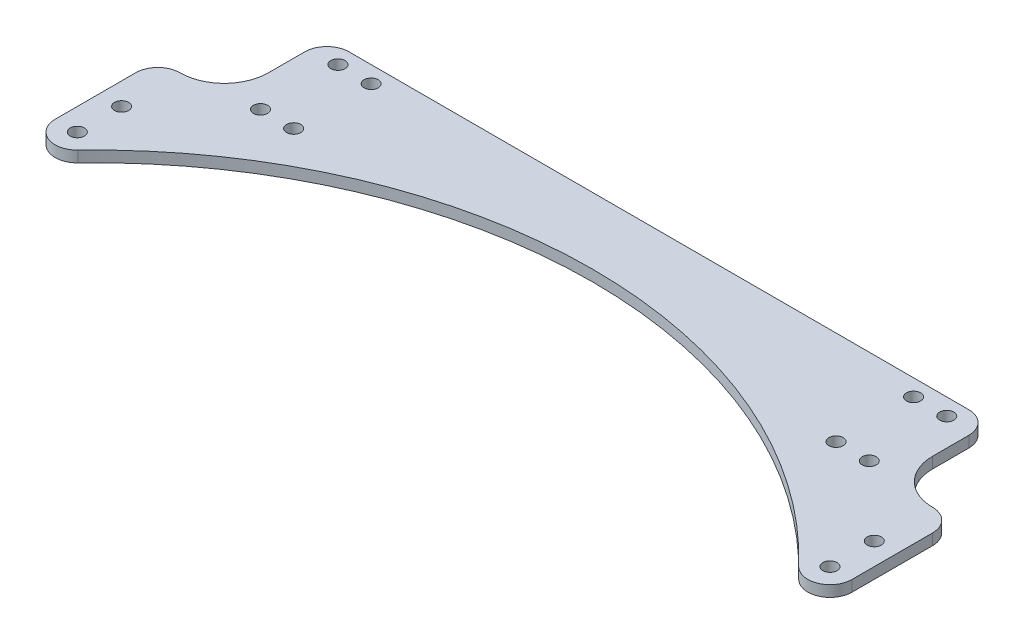
ISO-10303-21;
HEADER;
FILE_DESCRIPTION(('STEP AP214'),'2;1');
FILE_NAME('part.step','',(''),(''),'','','');
FILE_SCHEMA(('AUTOMOTIVE_DESIGN { 1 0 10303 214 1 1 1 1 }'));
ENDSEC;
DATA;
#1=APPLICATION_CONTEXT('core data for automotive mechanical design processes');
#2=APPLICATION_PROTOCOL_DEFINITION('international standard','automotive_design',2000,#1);
#3=PRODUCT_CONTEXT('',#1,'mechanical');
#4=PRODUCT('Part','Part','',(#3));
#5=PRODUCT_RELATED_PRODUCT_CATEGORY('part','',(#4));
#6=PRODUCT_DEFINITION_FORMATION('','',#4);
#7=PRODUCT_DEFINITION_CONTEXT('part definition',#1,'design');
#8=PRODUCT_DEFINITION('design','',#6,#7);
#9=PRODUCT_DEFINITION_SHAPE('','',#8);
#10=(LENGTH_UNIT() NAMED_UNIT(*) SI_UNIT(.MILLI.,.METRE.));
#11=(NAMED_UNIT(*) PLANE_ANGLE_UNIT() SI_UNIT($,.RADIAN.));
#12=(NAMED_UNIT(*) SI_UNIT($,.STERADIAN.) SOLID_ANGLE_UNIT());
#13=UNCERTAINTY_MEASURE_WITH_UNIT(LENGTH_MEASURE(1.E-05),#10,'distance_accuracy_value','');
#14=(GEOMETRIC_REPRESENTATION_CONTEXT(3) GLOBAL_UNCERTAINTY_ASSIGNED_CONTEXT((#13)) GLOBAL_UNIT_ASSIGNED_CONTEXT((#10,
#11,#12)) REPRESENTATION_CONTEXT('',''));
#15=CARTESIAN_POINT('',(0.,0.,0.));
#16=DIRECTION('',(0.,0.,1.));
#17=DIRECTION('',(1.,0.,0.));
#18=AXIS2_PLACEMENT_3D('',#15,#16,#17);
#19=CARTESIAN_POINT('',(228.6,3.175,-76.2));
#20=DIRECTION('',(-1.,0.,0.));
#21=DIRECTION('',(0.,0.,1.));
#22=AXIS2_PLACEMENT_3D('',#19,#20,#21);
#23=PLANE('',#22);
#24=DIRECTION('',(0.,0.,-1.));
#25=VECTOR('',#24,1.);
#26=CARTESIAN_POINT('',(228.6,0.,-76.2));
#27=LINE('',#26,#25);
#28=CARTESIAN_POINT('',(228.6,0.,-17.3036276963835));
#29=VERTEX_POINT('',#28);
#30=CARTESIAN_POINT('',(228.6,0.,-40.4018138481918));
#31=VERTEX_POINT('',#30);
#32=EDGE_CURVE('E192',#29,#31,#27,.T.);
#33=ORIENTED_EDGE('',*,*,#32,.T.);
#34=DIRECTION('',(0.,-1.,0.));
#35=VECTOR('',#34,1.);
#36=CARTESIAN_POINT('',(228.6,3.175,-40.4018138481917));
#37=LINE('',#36,#35);
#38=CARTESIAN_POINT('',(228.6,3.175,-40.4018138481918));
#39=VERTEX_POINT('',#38);
#40=EDGE_CURVE('E71',#31,#39,#37,.F.);
#41=ORIENTED_EDGE('',*,*,#40,.T.);
#42=DIRECTION('',(0.,0.,-1.));
#43=VECTOR('',#42,1.);
#44=CARTESIAN_POINT('',(228.6,3.175,-76.2));
#45=LINE('',#44,#43);
#46=CARTESIAN_POINT('',(228.6,3.175,-17.3036276963835));
#47=VERTEX_POINT('',#46);
#48=EDGE_CURVE('E289',#47,#39,#45,.T.);
#49=ORIENTED_EDGE('',*,*,#48,.F.);
#50=DIRECTION('',(0.,-1.,0.));
#51=VECTOR('',#50,1.);
#52=CARTESIAN_POINT('',(228.6,3.175,-17.3036276963835));
#53=LINE('',#52,#51);
#54=EDGE_CURVE('E222',#47,#29,#53,.T.);
#55=ORIENTED_EDGE('',*,*,#54,.T.);
#56=EDGE_LOOP('',(#33,#41,#49,#55));
#57=FACE_BOUND('',#56,.T.);
#58=ADVANCED_FACE('F51',(#57),#23,.F.);
#59=CARTESIAN_POINT('',(0.,3.175,-76.2));
#60=DIRECTION('',(0.,0.,1.));
#61=DIRECTION('',(1.,0.,0.));
#62=AXIS2_PLACEMENT_3D('',#59,#60,#61);
#63=PLANE('',#62);
#64=DIRECTION('',(-1.,0.,0.));
#65=VECTOR('',#64,1.);
#66=CARTESIAN_POINT('',(0.,0.,-76.2));
#67=LINE('',#66,#65);
#68=CARTESIAN_POINT('',(203.199999999947,0.,-76.2));
#69=VERTEX_POINT('',#68);
#70=CARTESIAN_POINT('',(25.39999999995,0.,-76.2));
#71=VERTEX_POINT('',#70);
#72=EDGE_CURVE('E200',#69,#71,#67,.T.);
#73=ORIENTED_EDGE('',*,*,#72,.T.);
#74=DIRECTION('',(0.,-1.,0.));
#75=VECTOR('',#74,1.);
#76=CARTESIAN_POINT('',(25.39999999995,3.175,-76.2));
#77=LINE('',#76,#75);
#78=CARTESIAN_POINT('',(25.39999999995,3.175,-76.2));
#79=VERTEX_POINT('',#78);
#80=EDGE_CURVE('E252',#71,#79,#77,.F.);
#81=ORIENTED_EDGE('',*,*,#80,.T.);
#82=DIRECTION('',(-1.,0.,0.));
#83=VECTOR('',#82,1.);
#84=CARTESIAN_POINT('',(0.,3.175,-76.2));
#85=LINE('',#84,#83);
#86=CARTESIAN_POINT('',(203.199999999947,3.175,-76.2));
#87=VERTEX_POINT('',#86);
#88=EDGE_CURVE('E296',#87,#79,#85,.T.);
#89=ORIENTED_EDGE('',*,*,#88,.F.);
#90=DIRECTION('',(0.,-1.,0.));
#91=VECTOR('',#90,1.);
#92=CARTESIAN_POINT('',(203.199999999947,3.175,-76.2));
#93=LINE('',#92,#91);
#94=EDGE_CURVE('E250',#87,#69,#93,.T.);
#95=ORIENTED_EDGE('',*,*,#94,.T.);
#96=EDGE_LOOP('',(#73,#81,#89,#95));
#97=FACE_BOUND('',#96,.T.);
#98=ADVANCED_FACE('F434',(#97),#63,.F.);
#99=CARTESIAN_POINT('',(114.3,3.175,85.725));
#100=DIRECTION('',(0.,-1.,0.));
#101=DIRECTION('',(0.,0.,-1.));
#102=AXIS2_PLACEMENT_3D('',#99,#100,#101);
#103=CYLINDRICAL_SURFACE('',#102,142.875);
#104=CARTESIAN_POINT('',(114.3,3.175,85.725));
#105=DIRECTION('',(0.,-1.,0.));
#106=DIRECTION('',(0.,0.,-1.));
#107=AXIS2_PLACEMENT_3D('',#104,#105,#106);
#108=CIRCLE('',#107,142.875);
#109=CARTESIAN_POINT('',(10.9436170212766,3.175,-12.9194307731331));
#110=VERTEX_POINT('',#109);
#111=CARTESIAN_POINT('',(217.656382978723,3.175,-12.9194307731331));
#112=VERTEX_POINT('',#111);
#113=EDGE_CURVE('E183',#110,#112,#108,.T.);
#114=ORIENTED_EDGE('',*,*,#113,.F.);
#115=DIRECTION('',(0.,-1.,0.));
#116=VECTOR('',#115,1.);
#117=CARTESIAN_POINT('',(10.9436170212766,3.175,-12.9194307731331));
#118=LINE('',#117,#116);
#119=CARTESIAN_POINT('',(10.9436170212766,0.,-12.9194307731331));
#120=VERTEX_POINT('',#119);
#121=EDGE_CURVE('E169',#110,#120,#118,.T.);
#122=ORIENTED_EDGE('',*,*,#121,.T.);
#123=CARTESIAN_POINT('',(114.3,0.,85.725));
#124=DIRECTION('',(0.,-1.,0.));
#125=DIRECTION('',(0.,0.,-1.));
#126=AXIS2_PLACEMENT_3D('',#123,#124,#125);
#127=CIRCLE('',#126,142.875);
#128=CARTESIAN_POINT('',(217.656382978723,0.,-12.9194307731331));
#129=VERTEX_POINT('',#128);
#130=EDGE_CURVE('E181',#120,#129,#127,.T.);
#131=ORIENTED_EDGE('',*,*,#130,.T.);
#132=DIRECTION('',(0.,-1.,0.));
#133=VECTOR('',#132,1.);
#134=CARTESIAN_POINT('',(217.656382978723,3.175,-12.9194307731331));
#135=LINE('',#134,#133);
#136=EDGE_CURVE('E184',#129,#112,#135,.F.);
#137=ORIENTED_EDGE('',*,*,#136,.T.);
#138=EDGE_LOOP('',(#114,#122,#131,#137));
#139=FACE_BOUND('',#138,.T.);
#140=ADVANCED_FACE('F179',(#139),#103,.F.);
#141=CARTESIAN_POINT('',(0.,3.175,0.));
#142=DIRECTION('',(1.,0.,0.));
#143=DIRECTION('',(0.,0.,-1.));
#144=AXIS2_PLACEMENT_3D('',#141,#142,#143);
#145=PLANE('',#144);
#146=DIRECTION('',(0.,0.,1.));
#147=VECTOR('',#146,1.);
#148=CARTESIAN_POINT('',(0.,3.175,0.));
#149=LINE('',#148,#147);
#150=CARTESIAN_POINT('',(0.,3.175,-40.4018138481917));
#151=VERTEX_POINT('',#150);
#152=CARTESIAN_POINT('',(0.,3.175,-17.3036276963835));
#153=VERTEX_POINT('',#152);
#154=EDGE_CURVE('E204',#151,#153,#149,.T.);
#155=ORIENTED_EDGE('',*,*,#154,.F.);
#156=DIRECTION('',(0.,-1.,0.));
#157=VECTOR('',#156,1.);
#158=CARTESIAN_POINT('',(0.,3.175,-40.4018138481917));
#159=LINE('',#158,#157);
#160=CARTESIAN_POINT('',(0.,0.,-40.4018138481917));
#161=VERTEX_POINT('',#160);
#162=EDGE_CURVE('E262',#151,#161,#159,.T.);
#163=ORIENTED_EDGE('',*,*,#162,.T.);
#164=DIRECTION('',(0.,0.,1.));
#165=VECTOR('',#164,1.);
#166=CARTESIAN_POINT('',(0.,0.,0.));
#167=LINE('',#166,#165);
#168=CARTESIAN_POINT('',(0.,0.,-17.3036276963835));
#169=VERTEX_POINT('',#168);
#170=EDGE_CURVE('E208',#161,#169,#167,.T.);
#171=ORIENTED_EDGE('',*,*,#170,.T.);
#172=DIRECTION('',(0.,-1.,0.));
#173=VECTOR('',#172,1.);
#174=CARTESIAN_POINT('',(0.,3.175,-17.3036276963835));
#175=LINE('',#174,#173);
#176=EDGE_CURVE('E171',#169,#153,#175,.F.);
#177=ORIENTED_EDGE('',*,*,#176,.T.);
#178=EDGE_LOOP('',(#155,#163,#171,#177));
#179=FACE_BOUND('',#178,.T.);
#180=ADVANCED_FACE('F307',(#179),#145,.F.);
#181=CARTESIAN_POINT('',(114.3,3.175,85.725));
#182=DIRECTION('',(0.,-1.,0.));
#183=DIRECTION('',(0.,0.,-1.));
#184=AXIS2_PLACEMENT_3D('',#181,#182,#183);
#185=PLANE('',#184);
#186=CARTESIAN_POINT('',(222.25,3.175,-17.3036276963835));
#187=DIRECTION('',(0.,-1.,0.));
#188=DIRECTION('',(0.,0.,-1.));
#189=AXIS2_PLACEMENT_3D('',#186,#187,#188);
#190=CIRCLE('',#189,2.03200000000001);
#191=CARTESIAN_POINT('',(222.25,3.175,-19.3356276963835));
#192=VERTEX_POINT('',#191);
#193=EDGE_CURVE('E322',#192,#192,#190,.T.);
#194=ORIENTED_EDGE('',*,*,#193,.T.);
#195=EDGE_LOOP('',(#194));
#196=FACE_BOUND('',#195,.T.);
#197=CARTESIAN_POINT('',(222.25,3.175,-30.0036276963835));
#198=DIRECTION('',(0.,-1.,0.));
#199=DIRECTION('',(0.,0.,-1.));
#200=AXIS2_PLACEMENT_3D('',#197,#198,#199);
#201=CIRCLE('',#200,2.03200000000001);
#202=CARTESIAN_POINT('',(222.25,3.175,-32.0356276963835));
#203=VERTEX_POINT('',#202);
#204=EDGE_CURVE('E342',#203,#203,#201,.T.);
#205=ORIENTED_EDGE('',*,*,#204,.T.);
#206=EDGE_LOOP('',(#205));
#207=FACE_BOUND('',#206,.T.);
#208=CARTESIAN_POINT('',(6.34999999999999,3.175,-30.0036276963835));
#209=DIRECTION('',(0.,-1.,0.));
#210=DIRECTION('',(0.,0.,-1.));
#211=AXIS2_PLACEMENT_3D('',#208,#209,#210);
#212=CIRCLE('',#211,2.032);
#213=CARTESIAN_POINT('',(6.34999999999999,3.175,-32.0356276963835));
#214=VERTEX_POINT('',#213);
#215=EDGE_CURVE('E331',#214,#214,#212,.T.);
#216=ORIENTED_EDGE('',*,*,#215,.T.);
#217=EDGE_LOOP('',(#216));
#218=FACE_BOUND('',#217,.T.);
#219=CARTESIAN_POINT('',(6.34999999999999,3.175,-17.3036276963835));
#220=DIRECTION('',(0.,-1.,0.));
#221=DIRECTION('',(0.,0.,-1.));
#222=AXIS2_PLACEMENT_3D('',#219,#220,#221);
#223=CIRCLE('',#222,2.032);
#224=CARTESIAN_POINT('',(6.34999999999999,3.175,-19.3356276963835));
#225=VERTEX_POINT('',#224);
#226=EDGE_CURVE('E347',#225,#225,#223,.T.);
#227=ORIENTED_EDGE('',*,*,#226,.T.);
#228=EDGE_LOOP('',(#227));
#229=FACE_BOUND('',#228,.T.);
#230=CARTESIAN_POINT('',(36.5124999999982,3.175,-71.4374999998848));
#231=DIRECTION('',(0.,-1.,0.));
#232=DIRECTION('',(0.,0.,-1.));
#233=AXIS2_PLACEMENT_3D('',#230,#231,#232);
#234=CIRCLE('',#233,2.032);
#235=CARTESIAN_POINT('',(36.5124999999982,3.175,-73.4694999998848));
#236=VERTEX_POINT('',#235);
#237=EDGE_CURVE('E365',#236,#236,#234,.T.);
#238=ORIENTED_EDGE('',*,*,#237,.T.);
#239=EDGE_LOOP('',(#238));
#240=FACE_BOUND('',#239,.T.);
#241=CARTESIAN_POINT('',(192.087500000002,3.175,-49.2124999998848));
#242=DIRECTION('',(0.,-1.,0.));
#243=DIRECTION('',(0.,0.,1.));
#244=AXIS2_PLACEMENT_3D('',#241,#242,#243);
#245=CIRCLE('',#244,2.03200000003425);
#246=CARTESIAN_POINT('',(192.087500000002,3.175,-47.1804999998506));
#247=VERTEX_POINT('',#246);
#248=EDGE_CURVE('E380',#247,#247,#245,.T.);
#249=ORIENTED_EDGE('',*,*,#248,.T.);
#250=EDGE_LOOP('',(#249));
#251=FACE_BOUND('',#250,.T.);
#252=CARTESIAN_POINT('',(201.612500000002,3.175,-49.2124999998848));
#253=DIRECTION('',(0.,-1.,0.));
#254=DIRECTION('',(0.,0.,1.));
#255=AXIS2_PLACEMENT_3D('',#252,#253,#254);
#256=CIRCLE('',#255,2.03200000003415);
#257=CARTESIAN_POINT('',(201.612500000002,3.175,-47.1804999998506));
#258=VERTEX_POINT('',#257);
#259=EDGE_CURVE('E376',#258,#258,#256,.T.);
#260=ORIENTED_EDGE('',*,*,#259,.T.);
#261=EDGE_LOOP('',(#260));
#262=FACE_BOUND('',#261,.T.);
#263=CARTESIAN_POINT('',(26.9874999999982,3.175,-49.2124999998848));
#264=DIRECTION('',(0.,-1.,0.));
#265=DIRECTION('',(0.,0.,-1.));
#266=AXIS2_PLACEMENT_3D('',#263,#264,#265);
#267=CIRCLE('',#266,2.03199999996107);
#268=CARTESIAN_POINT('',(26.9874999999982,3.175,-51.2444999998459));
#269=VERTEX_POINT('',#268);
#270=EDGE_CURVE('E389',#269,#269,#267,.T.);
#271=ORIENTED_EDGE('',*,*,#270,.T.);
#272=EDGE_LOOP('',(#271));
#273=FACE_BOUND('',#272,.T.);
#274=CARTESIAN_POINT('',(192.087500000002,3.175,-71.4374999998848));
#275=DIRECTION('',(0.,-1.,0.));
#276=DIRECTION('',(0.,0.,1.));
#277=AXIS2_PLACEMENT_3D('',#274,#275,#276);
#278=CIRCLE('',#277,2.03199999999998);
#279=CARTESIAN_POINT('',(192.087500000002,3.175,-69.4054999998848));
#280=VERTEX_POINT('',#279);
#281=EDGE_CURVE('E346',#280,#280,#278,.T.);
#282=ORIENTED_EDGE('',*,*,#281,.T.);
#283=EDGE_LOOP('',(#282));
#284=FACE_BOUND('',#283,.T.);
#285=CARTESIAN_POINT('',(201.612500000002,3.175,-71.4374999998848));
#286=DIRECTION('',(0.,-1.,0.));
#287=DIRECTION('',(0.,0.,1.));
#288=AXIS2_PLACEMENT_3D('',#285,#286,#287);
#289=CIRCLE('',#288,2.03200000000001);
#290=CARTESIAN_POINT('',(201.612500000002,3.175,-69.4054999998848));
#291=VERTEX_POINT('',#290);
#292=EDGE_CURVE('E351',#291,#291,#289,.T.);
#293=ORIENTED_EDGE('',*,*,#292,.T.);
#294=EDGE_LOOP('',(#293));
#295=FACE_BOUND('',#294,.T.);
#296=CARTESIAN_POINT('',(26.9874999999982,3.175,-71.4374999998848));
#297=DIRECTION('',(0.,-1.,0.));
#298=DIRECTION('',(0.,0.,-1.));
#299=AXIS2_PLACEMENT_3D('',#296,#297,#298);
#300=CIRCLE('',#299,2.03200000000001);
#301=CARTESIAN_POINT('',(26.9874999999982,3.175,-73.4694999998848));
#302=VERTEX_POINT('',#301);
#303=EDGE_CURVE('E361',#302,#302,#300,.T.);
#304=ORIENTED_EDGE('',*,*,#303,.T.);
#305=EDGE_LOOP('',(#304));
#306=FACE_BOUND('',#305,.T.);
#307=CARTESIAN_POINT('',(36.5124999999982,3.175,-49.2124999998848));
#308=DIRECTION('',(0.,-1.,0.));
#309=DIRECTION('',(0.,0.,-1.));
#310=AXIS2_PLACEMENT_3D('',#307,#308,#309);
#311=CIRCLE('',#310,2.03199999996113);
#312=CARTESIAN_POINT('',(36.5124999999982,3.175,-51.2444999998459));
#313=VERTEX_POINT('',#312);
#314=EDGE_CURVE('E194',#313,#313,#311,.T.);
#315=ORIENTED_EDGE('',*,*,#314,.T.);
#316=EDGE_LOOP('',(#315));
#317=FACE_BOUND('',#316,.T.);
#318=ORIENTED_EDGE('',*,*,#88,.T.);
#319=CARTESIAN_POINT('',(25.39999999995,3.175,-69.85));
#320=DIRECTION('',(0.,-1.,0.));
#321=DIRECTION('',(0.,0.,-1.));
#322=AXIS2_PLACEMENT_3D('',#319,#320,#321);
#323=CIRCLE('',#322,6.35);
#324=CARTESIAN_POINT('',(19.04999999995,3.175,-69.85));
#325=VERTEX_POINT('',#324);
#326=EDGE_CURVE('E258',#79,#325,#323,.F.);
#327=ORIENTED_EDGE('',*,*,#326,.T.);
#328=DIRECTION('',(0.,0.,1.));
#329=VECTOR('',#328,1.);
#330=CARTESIAN_POINT('',(19.04999999995,3.175,-46.7518138481917));
#331=LINE('',#330,#329);
#332=CARTESIAN_POINT('',(19.04999999995,3.175,-59.4518138481917));
#333=VERTEX_POINT('',#332);
#334=EDGE_CURVE('E324',#325,#333,#331,.T.);
#335=ORIENTED_EDGE('',*,*,#334,.T.);
#336=CARTESIAN_POINT('',(6.34999999994996,3.175,-59.4518138481917));
#337=DIRECTION('',(0.,-1.,0.));
#338=DIRECTION('',(0.,0.,-1.));
#339=AXIS2_PLACEMENT_3D('',#336,#337,#338);
#340=CIRCLE('',#339,12.7);
#341=CARTESIAN_POINT('',(6.35,3.175,-46.7518138481917));
#342=VERTEX_POINT('',#341);
#343=EDGE_CURVE('E267',#333,#342,#340,.T.);
#344=ORIENTED_EDGE('',*,*,#343,.T.);
#345=CARTESIAN_POINT('',(6.35,3.175,-40.4018138481917));
#346=DIRECTION('',(0.,-1.,0.));
#347=DIRECTION('',(0.,0.,-1.));
#348=AXIS2_PLACEMENT_3D('',#345,#346,#347);
#349=CIRCLE('',#348,6.35);
#350=EDGE_CURVE('E257',#342,#151,#349,.F.);
#351=ORIENTED_EDGE('',*,*,#350,.T.);
#352=ORIENTED_EDGE('',*,*,#154,.T.);
#353=CARTESIAN_POINT('',(6.34999999999999,3.175,-17.3036276963835));
#354=DIRECTION('',(0.,-1.,0.));
#355=DIRECTION('',(0.,0.,-1.));
#356=AXIS2_PLACEMENT_3D('',#353,#354,#355);
#357=CIRCLE('',#356,6.35);
#358=EDGE_CURVE('E216',#153,#110,#357,.F.);
#359=ORIENTED_EDGE('',*,*,#358,.T.);
#360=ORIENTED_EDGE('',*,*,#113,.T.);
#361=CARTESIAN_POINT('',(222.25,3.175,-17.3036276963835));
#362=DIRECTION('',(0.,-1.,0.));
#363=DIRECTION('',(0.,0.,-1.));
#364=AXIS2_PLACEMENT_3D('',#361,#362,#363);
#365=CIRCLE('',#364,6.35);
#366=EDGE_CURVE('E217',#112,#47,#365,.F.);
#367=ORIENTED_EDGE('',*,*,#366,.T.);
#368=ORIENTED_EDGE('',*,*,#48,.T.);
#369=CARTESIAN_POINT('',(222.25,3.175,-40.4018138481917));
#370=DIRECTION('',(0.,-1.,0.));
#371=DIRECTION('',(0.,0.,-1.));
#372=AXIS2_PLACEMENT_3D('',#369,#370,#371);
#373=CIRCLE('',#372,6.35);
#374=CARTESIAN_POINT('',(222.25,3.175,-46.7518138481917));
#375=VERTEX_POINT('',#374);
#376=EDGE_CURVE('E69',#39,#375,#373,.F.);
#377=ORIENTED_EDGE('',*,*,#376,.T.);
#378=CARTESIAN_POINT('',(222.249999999947,3.175,-59.4518138481917));
#379=DIRECTION('',(0.,-1.,0.));
#380=DIRECTION('',(0.,0.,-1.));
#381=AXIS2_PLACEMENT_3D('',#378,#379,#380);
#382=CIRCLE('',#381,12.7);
#383=CARTESIAN_POINT('',(209.549999999947,3.175,-59.4518138481917));
#384=VERTEX_POINT('',#383);
#385=EDGE_CURVE('E12',#375,#384,#382,.T.);
#386=ORIENTED_EDGE('',*,*,#385,.T.);
#387=DIRECTION('',(0.,0.,-1.));
#388=VECTOR('',#387,1.);
#389=CARTESIAN_POINT('',(209.549999999947,3.175,-46.7518138481917));
#390=LINE('',#389,#388);
#391=CARTESIAN_POINT('',(209.549999999947,3.175,-69.85));
#392=VERTEX_POINT('',#391);
#393=EDGE_CURVE('E272',#384,#392,#390,.T.);
#394=ORIENTED_EDGE('',*,*,#393,.T.);
#395=CARTESIAN_POINT('',(203.199999999947,3.175,-69.85));
#396=DIRECTION('',(0.,-1.,0.));
#397=DIRECTION('',(0.,0.,-1.));
#398=AXIS2_PLACEMENT_3D('',#395,#396,#397);
#399=CIRCLE('',#398,6.35);
#400=EDGE_CURVE('E251',#392,#87,#399,.F.);
#401=ORIENTED_EDGE('',*,*,#400,.T.);
#402=EDGE_LOOP('',(#318,#327,#335,#344,#351,#352,#359,#360,#367,#368,#377,#386,#394,#401));
#403=FACE_BOUND('',#402,.T.);
#404=ADVANCED_FACE('F295',(#196,#207,#218,#229,#240,#251,#262,#273,#284,#295,#306,#317,#403),
#185,.F.);
#405=CARTESIAN_POINT('',(114.3,0.,85.725));
#406=DIRECTION('',(0.,-1.,0.));
#407=DIRECTION('',(0.,0.,-1.));
#408=AXIS2_PLACEMENT_3D('',#405,#406,#407);
#409=PLANE('',#408);
#410=DIRECTION('',(0.,0.,1.));
#411=VECTOR('',#410,1.);
#412=CARTESIAN_POINT('',(19.04999999995,0.,-46.7518138481917));
#413=LINE('',#412,#411);
#414=CARTESIAN_POINT('',(19.04999999995,0.,-69.85));
#415=VERTEX_POINT('',#414);
#416=CARTESIAN_POINT('',(19.04999999995,0.,-59.4518138481917));
#417=VERTEX_POINT('',#416);
#418=EDGE_CURVE('E317',#415,#417,#413,.T.);
#419=ORIENTED_EDGE('',*,*,#418,.F.);
#420=CARTESIAN_POINT('',(25.39999999995,0.,-69.85));
#421=DIRECTION('',(0.,-1.,0.));
#422=DIRECTION('',(0.,0.,-1.));
#423=AXIS2_PLACEMENT_3D('',#420,#421,#422);
#424=CIRCLE('',#423,6.35);
#425=EDGE_CURVE('E244',#415,#71,#424,.T.);
#426=ORIENTED_EDGE('',*,*,#425,.T.);
#427=ORIENTED_EDGE('',*,*,#72,.F.);
#428=CARTESIAN_POINT('',(203.199999999947,0.,-69.85));
#429=DIRECTION('',(0.,-1.,0.));
#430=DIRECTION('',(0.,0.,-1.));
#431=AXIS2_PLACEMENT_3D('',#428,#429,#430);
#432=CIRCLE('',#431,6.35);
#433=CARTESIAN_POINT('',(209.549999999947,0.,-69.85));
#434=VERTEX_POINT('',#433);
#435=EDGE_CURVE('E239',#69,#434,#432,.T.);
#436=ORIENTED_EDGE('',*,*,#435,.T.);
#437=DIRECTION('',(0.,0.,-1.));
#438=VECTOR('',#437,1.);
#439=CARTESIAN_POINT('',(209.549999999947,0.,-46.7518138481917));
#440=LINE('',#439,#438);
#441=CARTESIAN_POINT('',(209.549999999947,0.,-59.4518138481917));
#442=VERTEX_POINT('',#441);
#443=EDGE_CURVE('E277',#442,#434,#440,.T.);
#444=ORIENTED_EDGE('',*,*,#443,.F.);
#445=CARTESIAN_POINT('',(222.249999999947,0.,-59.4518138481917));
#446=DIRECTION('',(0.,-1.,0.));
#447=DIRECTION('',(0.,0.,-1.));
#448=AXIS2_PLACEMENT_3D('',#445,#446,#447);
#449=CIRCLE('',#448,12.7);
#450=CARTESIAN_POINT('',(222.25,0.,-46.7518138481917));
#451=VERTEX_POINT('',#450);
#452=EDGE_CURVE('E58',#442,#451,#449,.F.);
#453=ORIENTED_EDGE('',*,*,#452,.T.);
#454=CARTESIAN_POINT('',(222.25,0.,-40.4018138481917));
#455=DIRECTION('',(0.,-1.,0.));
#456=DIRECTION('',(0.,0.,-1.));
#457=AXIS2_PLACEMENT_3D('',#454,#455,#456);
#458=CIRCLE('',#457,6.35);
#459=EDGE_CURVE('E238',#451,#31,#458,.T.);
#460=ORIENTED_EDGE('',*,*,#459,.T.);
#461=ORIENTED_EDGE('',*,*,#32,.F.);
#462=CARTESIAN_POINT('',(222.25,0.,-17.3036276963835));
#463=DIRECTION('',(0.,-1.,0.));
#464=DIRECTION('',(0.,0.,-1.));
#465=AXIS2_PLACEMENT_3D('',#462,#463,#464);
#466=CIRCLE('',#465,6.35);
#467=EDGE_CURVE('E174',#29,#129,#466,.T.);
#468=ORIENTED_EDGE('',*,*,#467,.T.);
#469=ORIENTED_EDGE('',*,*,#130,.F.);
#470=CARTESIAN_POINT('',(6.34999999999999,0.,-17.3036276963835));
#471=DIRECTION('',(0.,-1.,0.));
#472=DIRECTION('',(0.,0.,-1.));
#473=AXIS2_PLACEMENT_3D('',#470,#471,#472);
#474=CIRCLE('',#473,6.35);
#475=EDGE_CURVE('E164',#120,#169,#474,.T.);
#476=ORIENTED_EDGE('',*,*,#475,.T.);
#477=ORIENTED_EDGE('',*,*,#170,.F.);
#478=CARTESIAN_POINT('',(6.35,0.,-40.4018138481917));
#479=DIRECTION('',(0.,-1.,0.));
#480=DIRECTION('',(0.,0.,-1.));
#481=AXIS2_PLACEMENT_3D('',#478,#479,#480);
#482=CIRCLE('',#481,6.35);
#483=CARTESIAN_POINT('',(6.35,0.,-46.7518138481917));
#484=VERTEX_POINT('',#483);
#485=EDGE_CURVE('E243',#161,#484,#482,.T.);
#486=ORIENTED_EDGE('',*,*,#485,.T.);
#487=CARTESIAN_POINT('',(6.34999999994996,0.,-59.4518138481917));
#488=DIRECTION('',(0.,-1.,0.));
#489=DIRECTION('',(0.,0.,-1.));
#490=AXIS2_PLACEMENT_3D('',#487,#488,#489);
#491=CIRCLE('',#490,12.7);
#492=EDGE_CURVE('E261',#484,#417,#491,.F.);
#493=ORIENTED_EDGE('',*,*,#492,.T.);
#494=EDGE_LOOP('',(#419,#426,#427,#436,#444,#453,#460,#461,#468,#469,#476,#477,#486,#493));
#495=FACE_BOUND('',#494,.T.);
#496=CARTESIAN_POINT('',(222.25,0.,-17.3036276963835));
#497=DIRECTION('',(0.,-1.,0.));
#498=DIRECTION('',(0.,0.,-1.));
#499=AXIS2_PLACEMENT_3D('',#496,#497,#498);
#500=CIRCLE('',#499,2.03200000000001);
#501=CARTESIAN_POINT('',(222.25,0.,-19.3356276963835));
#502=VERTEX_POINT('',#501);
#503=EDGE_CURVE('E327',#502,#502,#500,.T.);
#504=ORIENTED_EDGE('',*,*,#503,.F.);
#505=EDGE_LOOP('',(#504));
#506=FACE_BOUND('',#505,.T.);
#507=CARTESIAN_POINT('',(222.25,0.,-30.0036276963835));
#508=DIRECTION('',(0.,-1.,0.));
#509=DIRECTION('',(0.,0.,-1.));
#510=AXIS2_PLACEMENT_3D('',#507,#508,#509);
#511=CIRCLE('',#510,2.03200000000001);
#512=CARTESIAN_POINT('',(222.25,0.,-32.0356276963835));
#513=VERTEX_POINT('',#512);
#514=EDGE_CURVE('E336',#513,#513,#511,.T.);
#515=ORIENTED_EDGE('',*,*,#514,.F.);
#516=EDGE_LOOP('',(#515));
#517=FACE_BOUND('',#516,.T.);
#518=CARTESIAN_POINT('',(6.34999999999999,0.,-30.0036276963835));
#519=DIRECTION('',(0.,-1.,0.));
#520=DIRECTION('',(0.,0.,-1.));
#521=AXIS2_PLACEMENT_3D('',#518,#519,#520);
#522=CIRCLE('',#521,2.032);
#523=CARTESIAN_POINT('',(6.34999999999999,0.,-32.0356276963835));
#524=VERTEX_POINT('',#523);
#525=EDGE_CURVE('E332',#524,#524,#522,.T.);
#526=ORIENTED_EDGE('',*,*,#525,.F.);
#527=EDGE_LOOP('',(#526));
#528=FACE_BOUND('',#527,.T.);
#529=CARTESIAN_POINT('',(6.34999999999999,0.,-17.3036276963835));
#530=DIRECTION('',(0.,-1.,0.));
#531=DIRECTION('',(0.,0.,-1.));
#532=AXIS2_PLACEMENT_3D('',#529,#530,#531);
#533=CIRCLE('',#532,2.032);
#534=CARTESIAN_POINT('',(6.34999999999999,0.,-19.3356276963835));
#535=VERTEX_POINT('',#534);
#536=EDGE_CURVE('E334',#535,#535,#533,.T.);
#537=ORIENTED_EDGE('',*,*,#536,.F.);
#538=EDGE_LOOP('',(#537));
#539=FACE_BOUND('',#538,.T.);
#540=CARTESIAN_POINT('',(36.5124999999982,0.,-71.4374999998848));
#541=DIRECTION('',(0.,-1.,0.));
#542=DIRECTION('',(0.,0.,-1.));
#543=AXIS2_PLACEMENT_3D('',#540,#541,#542);
#544=CIRCLE('',#543,2.032);
#545=CARTESIAN_POINT('',(36.5124999999982,0.,-73.4694999998848));
#546=VERTEX_POINT('',#545);
#547=EDGE_CURVE('E379',#546,#546,#544,.T.);
#548=ORIENTED_EDGE('',*,*,#547,.F.);
#549=EDGE_LOOP('',(#548));
#550=FACE_BOUND('',#549,.T.);
#551=CARTESIAN_POINT('',(192.087500000002,0.,-49.2124999998848));
#552=DIRECTION('',(0.,-1.,0.));
#553=DIRECTION('',(0.,0.,1.));
#554=AXIS2_PLACEMENT_3D('',#551,#552,#553);
#555=CIRCLE('',#554,2.03200000003425);
#556=CARTESIAN_POINT('',(192.087500000002,0.,-47.1804999998506));
#557=VERTEX_POINT('',#556);
#558=EDGE_CURVE('E373',#557,#557,#555,.T.);
#559=ORIENTED_EDGE('',*,*,#558,.F.);
#560=EDGE_LOOP('',(#559));
#561=FACE_BOUND('',#560,.T.);
#562=CARTESIAN_POINT('',(201.612500000002,0.,-49.2124999998848));
#563=DIRECTION('',(0.,-1.,0.));
#564=DIRECTION('',(0.,0.,1.));
#565=AXIS2_PLACEMENT_3D('',#562,#563,#564);
#566=CIRCLE('',#565,2.03200000003415);
#567=CARTESIAN_POINT('',(201.612500000002,0.,-47.1804999998506));
#568=VERTEX_POINT('',#567);
#569=EDGE_CURVE('E392',#568,#568,#566,.T.);
#570=ORIENTED_EDGE('',*,*,#569,.F.);
#571=EDGE_LOOP('',(#570));
#572=FACE_BOUND('',#571,.T.);
#573=CARTESIAN_POINT('',(26.9874999999982,0.,-49.2124999998848));
#574=DIRECTION('',(0.,-1.,0.));
#575=DIRECTION('',(0.,0.,-1.));
#576=AXIS2_PLACEMENT_3D('',#573,#574,#575);
#577=CIRCLE('',#576,2.03199999996107);
#578=CARTESIAN_POINT('',(26.9874999999982,0.,-51.2444999998459));
#579=VERTEX_POINT('',#578);
#580=EDGE_CURVE('E383',#579,#579,#577,.T.);
#581=ORIENTED_EDGE('',*,*,#580,.F.);
#582=EDGE_LOOP('',(#581));
#583=FACE_BOUND('',#582,.T.);
#584=CARTESIAN_POINT('',(192.087500000002,0.,-71.4374999998848));
#585=DIRECTION('',(0.,-1.,0.));
#586=DIRECTION('',(0.,0.,1.));
#587=AXIS2_PLACEMENT_3D('',#584,#585,#586);
#588=CIRCLE('',#587,2.03199999999998);
#589=CARTESIAN_POINT('',(192.087500000002,0.,-69.4054999998848));
#590=VERTEX_POINT('',#589);
#591=EDGE_CURVE('E355',#590,#590,#588,.T.);
#592=ORIENTED_EDGE('',*,*,#591,.F.);
#593=EDGE_LOOP('',(#592));
#594=FACE_BOUND('',#593,.T.);
#595=CARTESIAN_POINT('',(201.612500000002,0.,-71.4374999998848));
#596=DIRECTION('',(0.,-1.,0.));
#597=DIRECTION('',(0.,0.,1.));
#598=AXIS2_PLACEMENT_3D('',#595,#596,#597);
#599=CIRCLE('',#598,2.03200000000001);
#600=CARTESIAN_POINT('',(201.612500000002,0.,-69.4054999998848));
#601=VERTEX_POINT('',#600);
#602=EDGE_CURVE('E366',#601,#601,#599,.T.);
#603=ORIENTED_EDGE('',*,*,#602,.F.);
#604=EDGE_LOOP('',(#603));
#605=FACE_BOUND('',#604,.T.);
#606=CARTESIAN_POINT('',(26.9874999999982,0.,-71.4374999998848));
#607=DIRECTION('',(0.,-1.,0.));
#608=DIRECTION('',(0.,0.,-1.));
#609=AXIS2_PLACEMENT_3D('',#606,#607,#608);
#610=CIRCLE('',#609,2.03200000000001);
#611=CARTESIAN_POINT('',(26.9874999999982,0.,-73.4694999998848));
#612=VERTEX_POINT('',#611);
#613=EDGE_CURVE('E360',#612,#612,#610,.T.);
#614=ORIENTED_EDGE('',*,*,#613,.F.);
#615=EDGE_LOOP('',(#614));
#616=FACE_BOUND('',#615,.T.);
#617=CARTESIAN_POINT('',(36.5124999999982,0.,-49.2124999998848));
#618=DIRECTION('',(0.,-1.,0.));
#619=DIRECTION('',(0.,0.,-1.));
#620=AXIS2_PLACEMENT_3D('',#617,#618,#619);
#621=CIRCLE('',#620,2.03199999996113);
#622=CARTESIAN_POINT('',(36.5124999999982,0.,-51.2444999998459));
#623=VERTEX_POINT('',#622);
#624=EDGE_CURVE('E202',#623,#623,#621,.T.);
#625=ORIENTED_EDGE('',*,*,#624,.F.);
#626=EDGE_LOOP('',(#625));
#627=FACE_BOUND('',#626,.T.);
#628=ADVANCED_FACE('F189',(#495,#506,#517,#528,#539,#550,#561,#572,#583,#594,#605,#616,#627),
#409,.T.);
#629=CARTESIAN_POINT('',(36.5124999999982,3.175,-49.2124999998848));
#630=DIRECTION('',(0.,-1.,0.));
#631=DIRECTION('',(0.,0.,-1.));
#632=AXIS2_PLACEMENT_3D('',#629,#630,#631);
#633=CYLINDRICAL_SURFACE('',#632,2.03199999996113);
#634=ORIENTED_EDGE('',*,*,#314,.F.);
#635=EDGE_LOOP('',(#634));
#636=FACE_BOUND('',#635,.T.);
#637=ORIENTED_EDGE('',*,*,#624,.T.);
#638=EDGE_LOOP('',(#637));
#639=FACE_BOUND('',#638,.T.);
#640=ADVANCED_FACE('F408',(#636,#639),#633,.F.);
#641=CARTESIAN_POINT('',(26.9874999999982,3.175,-71.4374999998848));
#642=DIRECTION('',(0.,-1.,0.));
#643=DIRECTION('',(0.,0.,-1.));
#644=AXIS2_PLACEMENT_3D('',#641,#642,#643);
#645=CYLINDRICAL_SURFACE('',#644,2.03200000000001);
#646=ORIENTED_EDGE('',*,*,#303,.F.);
#647=EDGE_LOOP('',(#646));
#648=FACE_BOUND('',#647,.T.);
#649=ORIENTED_EDGE('',*,*,#613,.T.);
#650=EDGE_LOOP('',(#649));
#651=FACE_BOUND('',#650,.T.);
#652=ADVANCED_FACE('F421',(#648,#651),#645,.F.);
#653=CARTESIAN_POINT('',(201.612500000002,3.175,-71.4374999998848));
#654=DIRECTION('',(0.,-1.,0.));
#655=DIRECTION('',(0.,0.,-1.));
#656=AXIS2_PLACEMENT_3D('',#653,#654,#655);
#657=CYLINDRICAL_SURFACE('',#656,2.03200000000001);
#658=ORIENTED_EDGE('',*,*,#292,.F.);
#659=EDGE_LOOP('',(#658));
#660=FACE_BOUND('',#659,.T.);
#661=ORIENTED_EDGE('',*,*,#602,.T.);
#662=EDGE_LOOP('',(#661));
#663=FACE_BOUND('',#662,.T.);
#664=ADVANCED_FACE('F429',(#660,#663),#657,.F.);
#665=CARTESIAN_POINT('',(192.087500000002,3.175,-71.4374999998848));
#666=DIRECTION('',(0.,-1.,0.));
#667=DIRECTION('',(0.,0.,-1.));
#668=AXIS2_PLACEMENT_3D('',#665,#666,#667);
#669=CYLINDRICAL_SURFACE('',#668,2.03199999999998);
#670=ORIENTED_EDGE('',*,*,#281,.F.);
#671=EDGE_LOOP('',(#670));
#672=FACE_BOUND('',#671,.T.);
#673=ORIENTED_EDGE('',*,*,#591,.T.);
#674=EDGE_LOOP('',(#673));
#675=FACE_BOUND('',#674,.T.);
#676=ADVANCED_FACE('F506',(#672,#675),#669,.F.);
#677=CARTESIAN_POINT('',(26.9874999999982,3.175,-49.2124999998848));
#678=DIRECTION('',(0.,-1.,0.));
#679=DIRECTION('',(0.,0.,-1.));
#680=AXIS2_PLACEMENT_3D('',#677,#678,#679);
#681=CYLINDRICAL_SURFACE('',#680,2.03199999996107);
#682=ORIENTED_EDGE('',*,*,#270,.F.);
#683=EDGE_LOOP('',(#682));
#684=FACE_BOUND('',#683,.T.);
#685=ORIENTED_EDGE('',*,*,#580,.T.);
#686=EDGE_LOOP('',(#685));
#687=FACE_BOUND('',#686,.T.);
#688=ADVANCED_FACE('F401',(#684,#687),#681,.F.);
#689=CARTESIAN_POINT('',(201.612500000002,3.175,-49.2124999998848));
#690=DIRECTION('',(0.,-1.,0.));
#691=DIRECTION('',(0.,0.,-1.));
#692=AXIS2_PLACEMENT_3D('',#689,#690,#691);
#693=CYLINDRICAL_SURFACE('',#692,2.03200000003415);
#694=ORIENTED_EDGE('',*,*,#259,.F.);
#695=EDGE_LOOP('',(#694));
#696=FACE_BOUND('',#695,.T.);
#697=ORIENTED_EDGE('',*,*,#569,.T.);
#698=EDGE_LOOP('',(#697));
#699=FACE_BOUND('',#698,.T.);
#700=ADVANCED_FACE('F399',(#696,#699),#693,.F.);
#701=CARTESIAN_POINT('',(192.087500000002,3.175,-49.2124999998848));
#702=DIRECTION('',(0.,-1.,0.));
#703=DIRECTION('',(0.,0.,-1.));
#704=AXIS2_PLACEMENT_3D('',#701,#702,#703);
#705=CYLINDRICAL_SURFACE('',#704,2.03200000003425);
#706=ORIENTED_EDGE('',*,*,#248,.F.);
#707=EDGE_LOOP('',(#706));
#708=FACE_BOUND('',#707,.T.);
#709=ORIENTED_EDGE('',*,*,#558,.T.);
#710=EDGE_LOOP('',(#709));
#711=FACE_BOUND('',#710,.T.);
#712=ADVANCED_FACE('F405',(#708,#711),#705,.F.);
#713=CARTESIAN_POINT('',(36.5124999999982,3.175,-71.4374999998848));
#714=DIRECTION('',(0.,-1.,0.));
#715=DIRECTION('',(0.,0.,-1.));
#716=AXIS2_PLACEMENT_3D('',#713,#714,#715);
#717=CYLINDRICAL_SURFACE('',#716,2.032);
#718=ORIENTED_EDGE('',*,*,#237,.F.);
#719=EDGE_LOOP('',(#718));
#720=FACE_BOUND('',#719,.T.);
#721=ORIENTED_EDGE('',*,*,#547,.T.);
#722=EDGE_LOOP('',(#721));
#723=FACE_BOUND('',#722,.T.);
#724=ADVANCED_FACE('F446',(#720,#723),#717,.F.);
#725=CARTESIAN_POINT('',(6.34999999999999,3.175,-17.3036276963835));
#726=DIRECTION('',(0.,-1.,0.));
#727=DIRECTION('',(0.,0.,-1.));
#728=AXIS2_PLACEMENT_3D('',#725,#726,#727);
#729=CYLINDRICAL_SURFACE('',#728,6.35);
#730=ORIENTED_EDGE('',*,*,#358,.F.);
#731=ORIENTED_EDGE('',*,*,#176,.F.);
#732=ORIENTED_EDGE('',*,*,#475,.F.);
#733=ORIENTED_EDGE('',*,*,#121,.F.);
#734=EDGE_LOOP('',(#730,#731,#732,#733));
#735=FACE_BOUND('',#734,.T.);
#736=ADVANCED_FACE('F166',(#735),#729,.T.);
#737=CARTESIAN_POINT('',(222.25,3.175,-17.3036276963835));
#738=DIRECTION('',(0.,-1.,0.));
#739=DIRECTION('',(0.,0.,-1.));
#740=AXIS2_PLACEMENT_3D('',#737,#738,#739);
#741=CYLINDRICAL_SURFACE('',#740,6.35);
#742=ORIENTED_EDGE('',*,*,#366,.F.);
#743=ORIENTED_EDGE('',*,*,#136,.F.);
#744=ORIENTED_EDGE('',*,*,#467,.F.);
#745=ORIENTED_EDGE('',*,*,#54,.F.);
#746=EDGE_LOOP('',(#742,#743,#744,#745));
#747=FACE_BOUND('',#746,.T.);
#748=ADVANCED_FACE('F292',(#747),#741,.T.);
#749=CARTESIAN_POINT('',(6.34999999999999,3.175,-17.3036276963835));
#750=DIRECTION('',(0.,-1.,0.));
#751=DIRECTION('',(0.,0.,-1.));
#752=AXIS2_PLACEMENT_3D('',#749,#750,#751);
#753=CYLINDRICAL_SURFACE('',#752,2.032);
#754=ORIENTED_EDGE('',*,*,#226,.F.);
#755=EDGE_LOOP('',(#754));
#756=FACE_BOUND('',#755,.T.);
#757=ORIENTED_EDGE('',*,*,#536,.T.);
#758=EDGE_LOOP('',(#757));
#759=FACE_BOUND('',#758,.T.);
#760=ADVANCED_FACE('F452',(#756,#759),#753,.F.);
#761=CARTESIAN_POINT('',(6.34999999999999,3.175,-30.0036276963835));
#762=DIRECTION('',(0.,-1.,0.));
#763=DIRECTION('',(0.,0.,-1.));
#764=AXIS2_PLACEMENT_3D('',#761,#762,#763);
#765=CYLINDRICAL_SURFACE('',#764,2.032);
#766=ORIENTED_EDGE('',*,*,#215,.F.);
#767=EDGE_LOOP('',(#766));
#768=FACE_BOUND('',#767,.T.);
#769=ORIENTED_EDGE('',*,*,#525,.T.);
#770=EDGE_LOOP('',(#769));
#771=FACE_BOUND('',#770,.T.);
#772=ADVANCED_FACE('F590',(#768,#771),#765,.F.);
#773=CARTESIAN_POINT('',(222.25,3.175,-30.0036276963835));
#774=DIRECTION('',(0.,-1.,0.));
#775=DIRECTION('',(0.,0.,-1.));
#776=AXIS2_PLACEMENT_3D('',#773,#774,#775);
#777=CYLINDRICAL_SURFACE('',#776,2.03200000000001);
#778=ORIENTED_EDGE('',*,*,#204,.F.);
#779=EDGE_LOOP('',(#778));
#780=FACE_BOUND('',#779,.T.);
#781=ORIENTED_EDGE('',*,*,#514,.T.);
#782=EDGE_LOOP('',(#781));
#783=FACE_BOUND('',#782,.T.);
#784=ADVANCED_FACE('F596',(#780,#783),#777,.F.);
#785=CARTESIAN_POINT('',(222.25,3.175,-17.3036276963835));
#786=DIRECTION('',(0.,-1.,0.));
#787=DIRECTION('',(0.,0.,-1.));
#788=AXIS2_PLACEMENT_3D('',#785,#786,#787);
#789=CYLINDRICAL_SURFACE('',#788,2.03200000000001);
#790=ORIENTED_EDGE('',*,*,#193,.F.);
#791=EDGE_LOOP('',(#790));
#792=FACE_BOUND('',#791,.T.);
#793=ORIENTED_EDGE('',*,*,#503,.T.);
#794=EDGE_LOOP('',(#793));
#795=FACE_BOUND('',#794,.T.);
#796=ADVANCED_FACE('F485',(#792,#795),#789,.F.);
#797=CARTESIAN_POINT('',(209.549999999947,3.175,-46.7518138481917));
#798=DIRECTION('',(-1.,0.,0.));
#799=DIRECTION('',(0.,0.,1.));
#800=AXIS2_PLACEMENT_3D('',#797,#798,#799);
#801=PLANE('',#800);
#802=ORIENTED_EDGE('',*,*,#393,.F.);
#803=DIRECTION('',(0.,-1.,0.));
#804=VECTOR('',#803,1.);
#805=CARTESIAN_POINT('',(209.549999999947,0.,-59.4518138481917));
#806=LINE('',#805,#804);
#807=EDGE_CURVE('E234',#384,#442,#806,.T.);
#808=ORIENTED_EDGE('',*,*,#807,.T.);
#809=ORIENTED_EDGE('',*,*,#443,.T.);
#810=DIRECTION('',(0.,-1.,0.));
#811=VECTOR('',#810,1.);
#812=CARTESIAN_POINT('',(209.549999999947,3.175,-69.85));
#813=LINE('',#812,#811);
#814=EDGE_CURVE('E233',#434,#392,#813,.F.);
#815=ORIENTED_EDGE('',*,*,#814,.T.);
#816=EDGE_LOOP('',(#802,#808,#809,#815));
#817=FACE_BOUND('',#816,.T.);
#818=ADVANCED_FACE('F475',(#817),#801,.F.);
#819=CARTESIAN_POINT('',(19.04999999995,3.175,-46.7518138481917));
#820=DIRECTION('',(1.,0.,0.));
#821=DIRECTION('',(0.,0.,-1.));
#822=AXIS2_PLACEMENT_3D('',#819,#820,#821);
#823=PLANE('',#822);
#824=ORIENTED_EDGE('',*,*,#418,.T.);
#825=DIRECTION('',(0.,-1.,0.));
#826=VECTOR('',#825,1.);
#827=CARTESIAN_POINT('',(19.04999999995,3.175,-59.4518138481917));
#828=LINE('',#827,#826);
#829=EDGE_CURVE('E226',#417,#333,#828,.F.);
#830=ORIENTED_EDGE('',*,*,#829,.T.);
#831=ORIENTED_EDGE('',*,*,#334,.F.);
#832=DIRECTION('',(0.,-1.,0.));
#833=VECTOR('',#832,1.);
#834=CARTESIAN_POINT('',(19.04999999995,3.175,-69.85));
#835=LINE('',#834,#833);
#836=EDGE_CURVE('E221',#325,#415,#835,.T.);
#837=ORIENTED_EDGE('',*,*,#836,.T.);
#838=EDGE_LOOP('',(#824,#830,#831,#837));
#839=FACE_BOUND('',#838,.T.);
#840=ADVANCED_FACE('F319',(#839),#823,.F.);
#841=CARTESIAN_POINT('',(6.35,3.175,-40.4018138481917));
#842=DIRECTION('',(0.,-1.,0.));
#843=DIRECTION('',(0.,0.,-1.));
#844=AXIS2_PLACEMENT_3D('',#841,#842,#843);
#845=CYLINDRICAL_SURFACE('',#844,6.35);
#846=ORIENTED_EDGE('',*,*,#162,.F.);
#847=ORIENTED_EDGE('',*,*,#350,.F.);
#848=DIRECTION('',(0.,-1.,0.));
#849=VECTOR('',#848,1.);
#850=CARTESIAN_POINT('',(6.35,3.175,-46.7518138481917));
#851=LINE('',#850,#849);
#852=EDGE_CURVE('E269',#484,#342,#851,.F.);
#853=ORIENTED_EDGE('',*,*,#852,.F.);
#854=ORIENTED_EDGE('',*,*,#485,.F.);
#855=EDGE_LOOP('',(#846,#847,#853,#854));
#856=FACE_BOUND('',#855,.T.);
#857=ADVANCED_FACE('F315',(#856),#845,.T.);
#858=CARTESIAN_POINT('',(6.34999999994996,3.175,-59.4518138481917));
#859=DIRECTION('',(0.,1.,0.));
#860=DIRECTION('',(0.,0.,1.));
#861=AXIS2_PLACEMENT_3D('',#858,#859,#860);
#862=CYLINDRICAL_SURFACE('',#861,12.7);
#863=ORIENTED_EDGE('',*,*,#343,.F.);
#864=ORIENTED_EDGE('',*,*,#829,.F.);
#865=ORIENTED_EDGE('',*,*,#492,.F.);
#866=ORIENTED_EDGE('',*,*,#852,.T.);
#867=EDGE_LOOP('',(#863,#864,#865,#866));
#868=FACE_BOUND('',#867,.T.);
#869=ADVANCED_FACE('F313',(#868),#862,.F.);
#870=CARTESIAN_POINT('',(222.25,3.175,-40.4018138481917));
#871=DIRECTION('',(0.,-1.,0.));
#872=DIRECTION('',(0.,0.,-1.));
#873=AXIS2_PLACEMENT_3D('',#870,#871,#872);
#874=CYLINDRICAL_SURFACE('',#873,6.35);
#875=DIRECTION('',(0.,-1.,0.));
#876=VECTOR('',#875,1.);
#877=CARTESIAN_POINT('',(222.25,3.175,-46.7518138481917));
#878=LINE('',#877,#876);
#879=EDGE_CURVE('E54',#375,#451,#878,.T.);
#880=ORIENTED_EDGE('',*,*,#879,.F.);
#881=ORIENTED_EDGE('',*,*,#376,.F.);
#882=ORIENTED_EDGE('',*,*,#40,.F.);
#883=ORIENTED_EDGE('',*,*,#459,.F.);
#884=EDGE_LOOP('',(#880,#881,#882,#883));
#885=FACE_BOUND('',#884,.T.);
#886=ADVANCED_FACE('F287',(#885),#874,.T.);
#887=CARTESIAN_POINT('',(222.249999999947,3.175,-59.4518138481917));
#888=DIRECTION('',(0.,1.,0.));
#889=DIRECTION('',(0.,0.,1.));
#890=AXIS2_PLACEMENT_3D('',#887,#888,#889);
#891=CYLINDRICAL_SURFACE('',#890,12.7);
#892=ORIENTED_EDGE('',*,*,#385,.F.);
#893=ORIENTED_EDGE('',*,*,#879,.T.);
#894=ORIENTED_EDGE('',*,*,#452,.F.);
#895=ORIENTED_EDGE('',*,*,#807,.F.);
#896=EDGE_LOOP('',(#892,#893,#894,#895));
#897=FACE_BOUND('',#896,.T.);
#898=ADVANCED_FACE('F284',(#897),#891,.F.);
#899=CARTESIAN_POINT('',(25.39999999995,3.175,-69.85));
#900=DIRECTION('',(0.,-1.,0.));
#901=DIRECTION('',(0.,0.,-1.));
#902=AXIS2_PLACEMENT_3D('',#899,#900,#901);
#903=CYLINDRICAL_SURFACE('',#902,6.35);
#904=ORIENTED_EDGE('',*,*,#326,.F.);
#905=ORIENTED_EDGE('',*,*,#80,.F.);
#906=ORIENTED_EDGE('',*,*,#425,.F.);
#907=ORIENTED_EDGE('',*,*,#836,.F.);
#908=EDGE_LOOP('',(#904,#905,#906,#907));
#909=FACE_BOUND('',#908,.T.);
#910=ADVANCED_FACE('F456',(#909),#903,.T.);
#911=CARTESIAN_POINT('',(203.199999999947,3.175,-69.85));
#912=DIRECTION('',(0.,-1.,0.));
#913=DIRECTION('',(0.,0.,-1.));
#914=AXIS2_PLACEMENT_3D('',#911,#912,#913);
#915=CYLINDRICAL_SURFACE('',#914,6.35);
#916=ORIENTED_EDGE('',*,*,#400,.F.);
#917=ORIENTED_EDGE('',*,*,#814,.F.);
#918=ORIENTED_EDGE('',*,*,#435,.F.);
#919=ORIENTED_EDGE('',*,*,#94,.F.);
#920=EDGE_LOOP('',(#916,#917,#918,#919));
#921=FACE_BOUND('',#920,.T.);
#922=ADVANCED_FACE('F52',(#921),#915,.T.);
#923=CLOSED_SHELL('',(#58,#98,#140,#180,#404,#628,#640,#652,#664,#676,#688,#700,#712,#724,#736,
#748,#760,#772,#784,#796,#818,#840,#857,#869,#886,#898,#910,#922));
#924=MANIFOLD_SOLID_BREP('B2',#923);
#925=ADVANCED_BREP_SHAPE_REPRESENTATION('',(#18,#924),#14);
#926=SHAPE_DEFINITION_REPRESENTATION(#9,#925);
ENDSEC;
END-ISO-10303-21;
